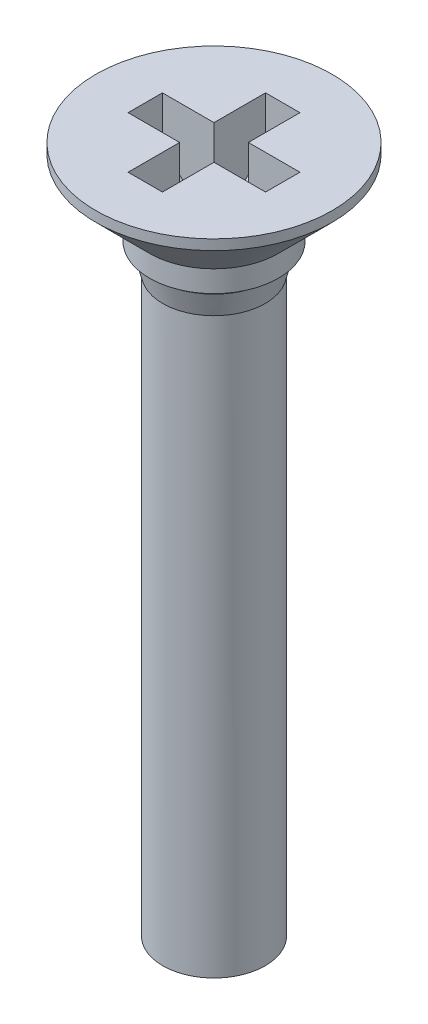
ISO-10303-21;
HEADER;
FILE_DESCRIPTION(('STEP AP214'),'2;1');
FILE_NAME('part.step','',(''),(''),'','','');
FILE_SCHEMA(('AUTOMOTIVE_DESIGN { 1 0 10303 214 1 1 1 1 }'));
ENDSEC;
DATA;
#1=APPLICATION_CONTEXT('core data for automotive mechanical design processes');
#2=APPLICATION_PROTOCOL_DEFINITION('international standard','automotive_design',2000,#1);
#3=PRODUCT_CONTEXT('',#1,'mechanical');
#4=PRODUCT('Part','Part','',(#3));
#5=PRODUCT_RELATED_PRODUCT_CATEGORY('part','',(#4));
#6=PRODUCT_DEFINITION_FORMATION('','',#4);
#7=PRODUCT_DEFINITION_CONTEXT('part definition',#1,'design');
#8=PRODUCT_DEFINITION('design','',#6,#7);
#9=PRODUCT_DEFINITION_SHAPE('','',#8);
#10=(LENGTH_UNIT() NAMED_UNIT(*) SI_UNIT(.MILLI.,.METRE.));
#11=(NAMED_UNIT(*) PLANE_ANGLE_UNIT() SI_UNIT($,.RADIAN.));
#12=(NAMED_UNIT(*) SI_UNIT($,.STERADIAN.) SOLID_ANGLE_UNIT());
#13=UNCERTAINTY_MEASURE_WITH_UNIT(LENGTH_MEASURE(1.E-05),#10,'distance_accuracy_value','');
#14=(GEOMETRIC_REPRESENTATION_CONTEXT(3) GLOBAL_UNCERTAINTY_ASSIGNED_CONTEXT((#13)) GLOBAL_UNIT_ASSIGNED_CONTEXT((#10,
#11,#12)) REPRESENTATION_CONTEXT('',''));
#15=CARTESIAN_POINT('',(0.,0.,0.));
#16=DIRECTION('',(0.,0.,1.));
#17=DIRECTION('',(1.,0.,0.));
#18=AXIS2_PLACEMENT_3D('',#15,#16,#17);
#19=CARTESIAN_POINT('',(0.,-2.65,-0.4));
#20=DIRECTION('',(0.,0.,-1.));
#21=DIRECTION('',(-1.,0.,0.));
#22=AXIS2_PLACEMENT_3D('',#19,#20,#21);
#23=PLANE('',#22);
#24=DIRECTION('',(0.,1.,0.));
#25=VECTOR('',#24,1.);
#26=CARTESIAN_POINT('',(0.4,-2.65,-0.4));
#27=LINE('',#26,#25);
#28=CARTESIAN_POINT('',(0.4,-2.1,-0.4));
#29=VERTEX_POINT('',#28);
#30=CARTESIAN_POINT('',(0.4,0.,-0.4));
#31=VERTEX_POINT('',#30);
#32=EDGE_CURVE('E202',#29,#31,#27,.T.);
#33=ORIENTED_EDGE('',*,*,#32,.F.);
#34=DIRECTION('',(1.,0.,0.));
#35=VECTOR('',#34,1.);
#36=CARTESIAN_POINT('',(-0.550000000000002,-2.1,-0.4));
#37=LINE('',#36,#35);
#38=CARTESIAN_POINT('',(0.550000000000002,-2.1,-0.4));
#39=VERTEX_POINT('',#38);
#40=EDGE_CURVE('E237',#29,#39,#37,.T.);
#41=ORIENTED_EDGE('',*,*,#40,.T.);
#42=DIRECTION('',(0.707106781186546,0.707106781186548,0.));
#43=VECTOR('',#42,1.);
#44=CARTESIAN_POINT('',(1.6,-1.05,-0.4));
#45=LINE('',#44,#43);
#46=CARTESIAN_POINT('',(1.6,-1.05,-0.4));
#47=VERTEX_POINT('',#46);
#48=EDGE_CURVE('E241',#39,#47,#45,.T.);
#49=ORIENTED_EDGE('',*,*,#48,.T.);
#50=DIRECTION('',(0.,1.,0.));
#51=VECTOR('',#50,1.);
#52=CARTESIAN_POINT('',(1.6,0.,-0.4));
#53=LINE('',#52,#51);
#54=CARTESIAN_POINT('',(1.6,0.,-0.4));
#55=VERTEX_POINT('',#54);
#56=EDGE_CURVE('E244',#47,#55,#53,.T.);
#57=ORIENTED_EDGE('',*,*,#56,.T.);
#58=DIRECTION('',(-1.,0.,0.));
#59=VECTOR('',#58,1.);
#60=CARTESIAN_POINT('',(1.6,0.,-0.4));
#61=LINE('',#60,#59);
#62=EDGE_CURVE('E248',#55,#31,#61,.T.);
#63=ORIENTED_EDGE('',*,*,#62,.T.);
#64=EDGE_LOOP('',(#33,#41,#49,#57,#63));
#65=FACE_BOUND('',#64,.T.);
#66=ADVANCED_FACE('F37',(#65),#23,.F.);
#67=CARTESIAN_POINT('',(0.,-2.65,0.4));
#68=DIRECTION('',(0.,0.,-1.));
#69=DIRECTION('',(-1.,0.,0.));
#70=AXIS2_PLACEMENT_3D('',#67,#68,#69);
#71=PLANE('',#70);
#72=DIRECTION('',(1.,0.,0.));
#73=VECTOR('',#72,1.);
#74=CARTESIAN_POINT('',(-0.550000000000002,-2.1,0.4));
#75=LINE('',#74,#73);
#76=CARTESIAN_POINT('',(0.4,-2.1,0.4));
#77=VERTEX_POINT('',#76);
#78=CARTESIAN_POINT('',(0.550000000000002,-2.1,0.4));
#79=VERTEX_POINT('',#78);
#80=EDGE_CURVE('E219',#77,#79,#75,.T.);
#81=ORIENTED_EDGE('',*,*,#80,.F.);
#82=DIRECTION('',(0.,1.,0.));
#83=VECTOR('',#82,1.);
#84=CARTESIAN_POINT('',(0.4,-2.65,0.4));
#85=LINE('',#84,#83);
#86=CARTESIAN_POINT('',(0.4,0.,0.4));
#87=VERTEX_POINT('',#86);
#88=EDGE_CURVE('E45',#77,#87,#85,.T.);
#89=ORIENTED_EDGE('',*,*,#88,.T.);
#90=DIRECTION('',(-1.,0.,0.));
#91=VECTOR('',#90,1.);
#92=CARTESIAN_POINT('',(1.6,0.,0.4));
#93=LINE('',#92,#91);
#94=CARTESIAN_POINT('',(1.6,0.,0.4));
#95=VERTEX_POINT('',#94);
#96=EDGE_CURVE('E228',#95,#87,#93,.T.);
#97=ORIENTED_EDGE('',*,*,#96,.F.);
#98=DIRECTION('',(0.,1.,0.));
#99=VECTOR('',#98,1.);
#100=CARTESIAN_POINT('',(1.6,0.,0.4));
#101=LINE('',#100,#99);
#102=CARTESIAN_POINT('',(1.6,-1.05,0.4));
#103=VERTEX_POINT('',#102);
#104=EDGE_CURVE('E225',#103,#95,#101,.T.);
#105=ORIENTED_EDGE('',*,*,#104,.F.);
#106=DIRECTION('',(0.707106781186546,0.707106781186548,0.));
#107=VECTOR('',#106,1.);
#108=CARTESIAN_POINT('',(1.6,-1.05,0.4));
#109=LINE('',#108,#107);
#110=EDGE_CURVE('E222',#79,#103,#109,.T.);
#111=ORIENTED_EDGE('',*,*,#110,.F.);
#112=EDGE_LOOP('',(#81,#89,#97,#105,#111));
#113=FACE_BOUND('',#112,.T.);
#114=ADVANCED_FACE('F291',(#113),#71,.T.);
#115=CARTESIAN_POINT('',(0.,0.,0.));
#116=DIRECTION('',(0.,-1.,0.));
#117=DIRECTION('',(1.,0.,0.));
#118=AXIS2_PLACEMENT_3D('',#115,#116,#117);
#119=PLANE('',#118);
#120=DIRECTION('',(1.,0.,0.));
#121=VECTOR('',#120,1.);
#122=CARTESIAN_POINT('',(-0.4,0.,1.6));
#123=LINE('',#122,#121);
#124=CARTESIAN_POINT('',(-0.4,0.,1.6));
#125=VERTEX_POINT('',#124);
#126=CARTESIAN_POINT('',(0.4,0.,1.6));
#127=VERTEX_POINT('',#126);
#128=EDGE_CURVE('E203',#125,#127,#123,.T.);
#129=ORIENTED_EDGE('',*,*,#128,.F.);
#130=DIRECTION('',(0.,0.,1.));
#131=VECTOR('',#130,1.);
#132=CARTESIAN_POINT('',(-0.4,0.,-1.6));
#133=LINE('',#132,#131);
#134=CARTESIAN_POINT('',(-0.4,0.,0.399999999999999));
#135=VERTEX_POINT('',#134);
#136=EDGE_CURVE('E196',#135,#125,#133,.T.);
#137=ORIENTED_EDGE('',*,*,#136,.F.);
#138=CARTESIAN_POINT('',(-1.6,0.,0.4));
#139=VERTEX_POINT('',#138);
#140=EDGE_CURVE('E227',#135,#139,#93,.T.);
#141=ORIENTED_EDGE('',*,*,#140,.T.);
#142=DIRECTION('',(0.,0.,1.));
#143=VECTOR('',#142,1.);
#144=CARTESIAN_POINT('',(-1.6,0.,-0.4));
#145=LINE('',#144,#143);
#146=CARTESIAN_POINT('',(-1.6,0.,-0.4));
#147=VERTEX_POINT('',#146);
#148=EDGE_CURVE('E258',#147,#139,#145,.T.);
#149=ORIENTED_EDGE('',*,*,#148,.F.);
#150=CARTESIAN_POINT('',(-0.4,0.,-0.4));
#151=VERTEX_POINT('',#150);
#152=EDGE_CURVE('E247',#151,#147,#61,.T.);
#153=ORIENTED_EDGE('',*,*,#152,.F.);
#154=CARTESIAN_POINT('',(-0.4,0.,-1.6));
#155=VERTEX_POINT('',#154);
#156=EDGE_CURVE('E197',#155,#151,#133,.T.);
#157=ORIENTED_EDGE('',*,*,#156,.F.);
#158=DIRECTION('',(1.,0.,0.));
#159=VECTOR('',#158,1.);
#160=CARTESIAN_POINT('',(-0.4,0.,-1.6));
#161=LINE('',#160,#159);
#162=CARTESIAN_POINT('',(0.4,0.,-1.6));
#163=VERTEX_POINT('',#162);
#164=EDGE_CURVE('E205',#155,#163,#161,.T.);
#165=ORIENTED_EDGE('',*,*,#164,.T.);
#166=DIRECTION('',(0.,0.,1.));
#167=VECTOR('',#166,1.);
#168=CARTESIAN_POINT('',(0.4,0.,-1.6));
#169=LINE('',#168,#167);
#170=EDGE_CURVE('E181',#163,#31,#169,.T.);
#171=ORIENTED_EDGE('',*,*,#170,.T.);
#172=ORIENTED_EDGE('',*,*,#62,.F.);
#173=DIRECTION('',(0.,0.,1.));
#174=VECTOR('',#173,1.);
#175=CARTESIAN_POINT('',(1.6,0.,-0.4));
#176=LINE('',#175,#174);
#177=EDGE_CURVE('E261',#55,#95,#176,.T.);
#178=ORIENTED_EDGE('',*,*,#177,.T.);
#179=ORIENTED_EDGE('',*,*,#96,.T.);
#180=EDGE_CURVE('E60',#87,#127,#169,.T.);
#181=ORIENTED_EDGE('',*,*,#180,.T.);
#182=EDGE_LOOP('',(#129,#137,#141,#149,#153,#157,#165,#171,#172,#178,#179,#181));
#183=FACE_BOUND('',#182,.T.);
#184=CARTESIAN_POINT('',(0.,0.,0.));
#185=DIRECTION('',(0.,1.,0.));
#186=DIRECTION('',(-1.,0.,0.));
#187=AXIS2_PLACEMENT_3D('',#184,#185,#186);
#188=CIRCLE('',#187,2.75);
#189=CARTESIAN_POINT('',(-2.75,0.,0.));
#190=VERTEX_POINT('',#189);
#191=EDGE_CURVE('E287',#190,#190,#188,.T.);
#192=ORIENTED_EDGE('',*,*,#191,.T.);
#193=EDGE_LOOP('',(#192));
#194=FACE_BOUND('',#193,.T.);
#195=ADVANCED_FACE('F39',(#183,#194),#119,.F.);
#196=CARTESIAN_POINT('',(0.,0.,0.));
#197=DIRECTION('',(0.,1.,0.));
#198=DIRECTION('',(-1.,0.,0.));
#199=AXIS2_PLACEMENT_3D('',#196,#197,#198);
#200=CYLINDRICAL_SURFACE('',#199,2.75);
#201=ORIENTED_EDGE('',*,*,#191,.F.);
#202=EDGE_LOOP('',(#201));
#203=FACE_BOUND('',#202,.T.);
#204=CARTESIAN_POINT('',(0.,-0.237500000000007,0.));
#205=DIRECTION('',(0.,1.,0.));
#206=DIRECTION('',(-1.,0.,0.));
#207=AXIS2_PLACEMENT_3D('',#204,#205,#206);
#208=CIRCLE('',#207,2.75);
#209=CARTESIAN_POINT('',(-2.75,-0.237500000000007,0.));
#210=VERTEX_POINT('',#209);
#211=EDGE_CURVE('E284',#210,#210,#208,.T.);
#212=ORIENTED_EDGE('',*,*,#211,.T.);
#213=EDGE_LOOP('',(#212));
#214=FACE_BOUND('',#213,.T.);
#215=ADVANCED_FACE('F396',(#203,#214),#200,.T.);
#216=CARTESIAN_POINT('',(0.,-1.4875,0.));
#217=DIRECTION('',(0.,1.,0.));
#218=DIRECTION('',(-1.,0.,0.));
#219=AXIS2_PLACEMENT_3D('',#216,#217,#218);
#220=CONICAL_SURFACE('',#219,1.5,0.78539816339745);
#221=ORIENTED_EDGE('',*,*,#211,.F.);
#222=EDGE_LOOP('',(#221));
#223=FACE_BOUND('',#222,.T.);
#224=CARTESIAN_POINT('',(0.,-1.4875,0.));
#225=DIRECTION('',(0.,1.,0.));
#226=DIRECTION('',(-1.,0.,0.));
#227=AXIS2_PLACEMENT_3D('',#224,#225,#226);
#228=CIRCLE('',#227,1.5);
#229=CARTESIAN_POINT('',(-1.5,-1.4875,0.));
#230=VERTEX_POINT('',#229);
#231=EDGE_CURVE('E281',#230,#230,#228,.T.);
#232=ORIENTED_EDGE('',*,*,#231,.T.);
#233=EDGE_LOOP('',(#232));
#234=FACE_BOUND('',#233,.T.);
#235=ADVANCED_FACE('F393',(#223,#234),#220,.T.);
#236=CARTESIAN_POINT('',(0.,0.,0.));
#237=DIRECTION('',(0.,1.,0.));
#238=DIRECTION('',(-1.,0.,0.));
#239=AXIS2_PLACEMENT_3D('',#236,#237,#238);
#240=CYLINDRICAL_SURFACE('',#239,1.5);
#241=ORIENTED_EDGE('',*,*,#231,.F.);
#242=EDGE_LOOP('',(#241));
#243=FACE_BOUND('',#242,.T.);
#244=CARTESIAN_POINT('',(0.,-1.9875,0.));
#245=DIRECTION('',(0.,1.,0.));
#246=DIRECTION('',(-1.,0.,0.));
#247=AXIS2_PLACEMENT_3D('',#244,#245,#246);
#248=CIRCLE('',#247,1.5);
#249=CARTESIAN_POINT('',(-1.5,-1.9875,0.));
#250=VERTEX_POINT('',#249);
#251=EDGE_CURVE('E278',#250,#250,#248,.T.);
#252=ORIENTED_EDGE('',*,*,#251,.T.);
#253=EDGE_LOOP('',(#252));
#254=FACE_BOUND('',#253,.T.);
#255=ADVANCED_FACE('F389',(#243,#254),#240,.T.);
#256=CARTESIAN_POINT('',(1.5,-1.9875,0.));
#257=DIRECTION('',(0.,1.,0.));
#258=DIRECTION('',(-1.,0.,0.));
#259=AXIS2_PLACEMENT_3D('',#256,#257,#258);
#260=PLANE('',#259);
#261=ORIENTED_EDGE('',*,*,#251,.F.);
#262=EDGE_LOOP('',(#261));
#263=FACE_BOUND('',#262,.T.);
#264=CARTESIAN_POINT('',(0.,-1.9875,0.));
#265=DIRECTION('',(0.,1.,0.));
#266=DIRECTION('',(-1.,0.,0.));
#267=AXIS2_PLACEMENT_3D('',#264,#265,#266);
#268=CIRCLE('',#267,1.3375);
#269=CARTESIAN_POINT('',(-1.3375,-1.9875,0.));
#270=VERTEX_POINT('',#269);
#271=EDGE_CURVE('E275',#270,#270,#268,.T.);
#272=ORIENTED_EDGE('',*,*,#271,.T.);
#273=EDGE_LOOP('',(#272));
#274=FACE_BOUND('',#273,.T.);
#275=ADVANCED_FACE('F385',(#263,#274),#260,.F.);
#276=CARTESIAN_POINT('',(0.,0.,0.));
#277=DIRECTION('',(0.,1.,0.));
#278=DIRECTION('',(-1.,0.,0.));
#279=AXIS2_PLACEMENT_3D('',#276,#277,#278);
#280=CYLINDRICAL_SURFACE('',#279,1.3375);
#281=ORIENTED_EDGE('',*,*,#271,.F.);
#282=EDGE_LOOP('',(#281));
#283=FACE_BOUND('',#282,.T.);
#284=CARTESIAN_POINT('',(0.,-2.11258468371008,0.));
#285=DIRECTION('',(0.,1.,0.));
#286=DIRECTION('',(-1.,0.,0.));
#287=AXIS2_PLACEMENT_3D('',#284,#285,#286);
#288=CIRCLE('',#287,1.3375);
#289=CARTESIAN_POINT('',(-1.3375,-2.11258468371008,0.));
#290=VERTEX_POINT('',#289);
#291=EDGE_CURVE('E272',#290,#290,#288,.T.);
#292=ORIENTED_EDGE('',*,*,#291,.T.);
#293=EDGE_LOOP('',(#292));
#294=FACE_BOUND('',#293,.T.);
#295=ADVANCED_FACE('F381',(#283,#294),#280,.T.);
#296=CARTESIAN_POINT('',(0.,-2.65,0.));
#297=DIRECTION('',(0.,1.,0.));
#298=DIRECTION('',(-1.,0.,0.));
#299=AXIS2_PLACEMENT_3D('',#296,#297,#298);
#300=CONICAL_SURFACE('',#299,1.1935,0.26179938779915);
#301=ORIENTED_EDGE('',*,*,#291,.F.);
#302=EDGE_LOOP('',(#301));
#303=FACE_BOUND('',#302,.T.);
#304=CARTESIAN_POINT('',(0.,-2.65,0.));
#305=DIRECTION('',(0.,1.,0.));
#306=DIRECTION('',(-1.,0.,0.));
#307=AXIS2_PLACEMENT_3D('',#304,#305,#306);
#308=CIRCLE('',#307,1.1935);
#309=CARTESIAN_POINT('',(-1.1935,-2.65,0.));
#310=VERTEX_POINT('',#309);
#311=EDGE_CURVE('E257',#310,#310,#308,.T.);
#312=ORIENTED_EDGE('',*,*,#311,.T.);
#313=EDGE_LOOP('',(#312));
#314=FACE_BOUND('',#313,.T.);
#315=ADVANCED_FACE('F377',(#303,#314),#300,.T.);
#316=CARTESIAN_POINT('',(0.,0.,0.));
#317=DIRECTION('',(0.,1.,0.));
#318=DIRECTION('',(-1.,0.,0.));
#319=AXIS2_PLACEMENT_3D('',#316,#317,#318);
#320=CYLINDRICAL_SURFACE('',#319,1.1935);
#321=ORIENTED_EDGE('',*,*,#311,.F.);
#322=EDGE_LOOP('',(#321));
#323=FACE_BOUND('',#322,.T.);
#324=CARTESIAN_POINT('',(0.,-16.,0.));
#325=DIRECTION('',(0.,-1.,0.));
#326=DIRECTION('',(1.,0.,0.));
#327=AXIS2_PLACEMENT_3D('',#324,#325,#326);
#328=CIRCLE('',#327,1.1935);
#329=CARTESIAN_POINT('',(1.1935,-16.,0.));
#330=VERTEX_POINT('',#329);
#331=EDGE_CURVE('E172',#330,#330,#328,.T.);
#332=ORIENTED_EDGE('',*,*,#331,.F.);
#333=EDGE_LOOP('',(#332));
#334=FACE_BOUND('',#333,.T.);
#335=ADVANCED_FACE('F374',(#323,#334),#320,.T.);
#336=CARTESIAN_POINT('',(-1.6,-1.05,-0.4));
#337=DIRECTION('',(-0.707106781186548,-0.707106781186546,0.));
#338=DIRECTION('',(0.707106781186547,-0.707106781186548,0.));
#339=AXIS2_PLACEMENT_3D('',#336,#337,#338);
#340=PLANE('',#339);
#341=DIRECTION('',(0.,0.,1.));
#342=VECTOR('',#341,1.);
#343=CARTESIAN_POINT('',(-0.550000000000002,-2.1,-0.4));
#344=LINE('',#343,#342);
#345=CARTESIAN_POINT('',(-0.550000000000002,-2.1,-0.4));
#346=VERTEX_POINT('',#345);
#347=CARTESIAN_POINT('',(-0.550000000000002,-2.1,0.4));
#348=VERTEX_POINT('',#347);
#349=EDGE_CURVE('E254',#346,#348,#344,.T.);
#350=ORIENTED_EDGE('',*,*,#349,.F.);
#351=DIRECTION('',(0.707106781186546,-0.707106781186548,0.));
#352=VECTOR('',#351,1.);
#353=CARTESIAN_POINT('',(-1.6,-1.05,-0.4));
#354=LINE('',#353,#352);
#355=CARTESIAN_POINT('',(-1.6,-1.05,-0.4));
#356=VERTEX_POINT('',#355);
#357=EDGE_CURVE('E234',#356,#346,#354,.T.);
#358=ORIENTED_EDGE('',*,*,#357,.F.);
#359=DIRECTION('',(0.,0.,1.));
#360=VECTOR('',#359,1.);
#361=CARTESIAN_POINT('',(-1.6,-1.05,-0.4));
#362=LINE('',#361,#360);
#363=CARTESIAN_POINT('',(-1.6,-1.05,0.4));
#364=VERTEX_POINT('',#363);
#365=EDGE_CURVE('E255',#356,#364,#362,.T.);
#366=ORIENTED_EDGE('',*,*,#365,.T.);
#367=DIRECTION('',(0.707106781186546,-0.707106781186548,0.));
#368=VECTOR('',#367,1.);
#369=CARTESIAN_POINT('',(-1.6,-1.05,0.4));
#370=LINE('',#369,#368);
#371=EDGE_CURVE('E216',#364,#348,#370,.T.);
#372=ORIENTED_EDGE('',*,*,#371,.T.);
#373=EDGE_LOOP('',(#350,#358,#366,#372));
#374=FACE_BOUND('',#373,.T.);
#375=ADVANCED_FACE('F328',(#374),#340,.F.);
#376=CARTESIAN_POINT('',(-1.6,0.,-0.4));
#377=DIRECTION('',(-1.,0.,0.));
#378=DIRECTION('',(0.,0.,1.));
#379=AXIS2_PLACEMENT_3D('',#376,#377,#378);
#380=PLANE('',#379);
#381=ORIENTED_EDGE('',*,*,#365,.F.);
#382=DIRECTION('',(0.,-1.,0.));
#383=VECTOR('',#382,1.);
#384=CARTESIAN_POINT('',(-1.6,0.,-0.4));
#385=LINE('',#384,#383);
#386=EDGE_CURVE('E251',#147,#356,#385,.T.);
#387=ORIENTED_EDGE('',*,*,#386,.F.);
#388=ORIENTED_EDGE('',*,*,#148,.T.);
#389=DIRECTION('',(0.,-1.,0.));
#390=VECTOR('',#389,1.);
#391=CARTESIAN_POINT('',(-1.6,0.,0.4));
#392=LINE('',#391,#390);
#393=EDGE_CURVE('E231',#139,#364,#392,.T.);
#394=ORIENTED_EDGE('',*,*,#393,.T.);
#395=EDGE_LOOP('',(#381,#387,#388,#394));
#396=FACE_BOUND('',#395,.T.);
#397=ADVANCED_FACE('F373',(#396),#380,.F.);
#398=CARTESIAN_POINT('',(1.6,0.,-0.4));
#399=DIRECTION('',(1.,0.,0.));
#400=DIRECTION('',(0.,0.,-1.));
#401=AXIS2_PLACEMENT_3D('',#398,#399,#400);
#402=PLANE('',#401);
#403=ORIENTED_EDGE('',*,*,#177,.F.);
#404=ORIENTED_EDGE('',*,*,#56,.F.);
#405=DIRECTION('',(0.,0.,1.));
#406=VECTOR('',#405,1.);
#407=CARTESIAN_POINT('',(1.6,-1.05,-0.4));
#408=LINE('',#407,#406);
#409=EDGE_CURVE('E264',#47,#103,#408,.T.);
#410=ORIENTED_EDGE('',*,*,#409,.T.);
#411=ORIENTED_EDGE('',*,*,#104,.T.);
#412=EDGE_LOOP('',(#403,#404,#410,#411));
#413=FACE_BOUND('',#412,.T.);
#414=ADVANCED_FACE('F300',(#413),#402,.F.);
#415=CARTESIAN_POINT('',(1.6,-1.05,-0.4));
#416=DIRECTION('',(0.707106781186548,-0.707106781186546,0.));
#417=DIRECTION('',(0.707106781186547,0.707106781186548,0.));
#418=AXIS2_PLACEMENT_3D('',#415,#416,#417);
#419=PLANE('',#418);
#420=ORIENTED_EDGE('',*,*,#409,.F.);
#421=ORIENTED_EDGE('',*,*,#48,.F.);
#422=DIRECTION('',(0.,0.,1.));
#423=VECTOR('',#422,1.);
#424=CARTESIAN_POINT('',(0.550000000000002,-2.1,-0.4));
#425=LINE('',#424,#423);
#426=EDGE_CURVE('E266',#39,#79,#425,.T.);
#427=ORIENTED_EDGE('',*,*,#426,.T.);
#428=ORIENTED_EDGE('',*,*,#110,.T.);
#429=EDGE_LOOP('',(#420,#421,#427,#428));
#430=FACE_BOUND('',#429,.T.);
#431=ADVANCED_FACE('F306',(#430),#419,.F.);
#432=CARTESIAN_POINT('',(-0.550000000000002,-2.1,-0.4));
#433=DIRECTION('',(0.,-1.,0.));
#434=DIRECTION('',(0.,0.,-1.));
#435=AXIS2_PLACEMENT_3D('',#432,#433,#434);
#436=PLANE('',#435);
#437=CARTESIAN_POINT('',(-0.4,-2.1,0.4));
#438=VERTEX_POINT('',#437);
#439=EDGE_CURVE('E220',#348,#438,#75,.T.);
#440=ORIENTED_EDGE('',*,*,#439,.T.);
#441=DIRECTION('',(0.,0.,-1.));
#442=VECTOR('',#441,1.);
#443=CARTESIAN_POINT('',(-0.4,-2.1,0.550000000000002));
#444=LINE('',#443,#442);
#445=CARTESIAN_POINT('',(-0.4,-2.1,0.550000000000002));
#446=VERTEX_POINT('',#445);
#447=EDGE_CURVE('E156',#446,#438,#444,.T.);
#448=ORIENTED_EDGE('',*,*,#447,.F.);
#449=DIRECTION('',(1.,0.,0.));
#450=VECTOR('',#449,1.);
#451=CARTESIAN_POINT('',(-0.4,-2.1,0.550000000000002));
#452=LINE('',#451,#450);
#453=CARTESIAN_POINT('',(0.4,-2.1,0.550000000000002));
#454=VERTEX_POINT('',#453);
#455=EDGE_CURVE('E150',#446,#454,#452,.T.);
#456=ORIENTED_EDGE('',*,*,#455,.T.);
#457=DIRECTION('',(0.,0.,-1.));
#458=VECTOR('',#457,1.);
#459=CARTESIAN_POINT('',(0.4,-2.1,0.550000000000002));
#460=LINE('',#459,#458);
#461=EDGE_CURVE('E154',#454,#77,#460,.T.);
#462=ORIENTED_EDGE('',*,*,#461,.T.);
#463=ORIENTED_EDGE('',*,*,#80,.T.);
#464=ORIENTED_EDGE('',*,*,#426,.F.);
#465=ORIENTED_EDGE('',*,*,#40,.F.);
#466=CARTESIAN_POINT('',(0.4,-2.1,-0.550000000000002));
#467=VERTEX_POINT('',#466);
#468=EDGE_CURVE('E52',#29,#467,#460,.T.);
#469=ORIENTED_EDGE('',*,*,#468,.T.);
#470=DIRECTION('',(1.,0.,0.));
#471=VECTOR('',#470,1.);
#472=CARTESIAN_POINT('',(-0.4,-2.1,-0.550000000000002));
#473=LINE('',#472,#471);
#474=CARTESIAN_POINT('',(-0.4,-2.1,-0.550000000000002));
#475=VERTEX_POINT('',#474);
#476=EDGE_CURVE('E161',#475,#467,#473,.T.);
#477=ORIENTED_EDGE('',*,*,#476,.F.);
#478=CARTESIAN_POINT('',(-0.4,-2.1,-0.4));
#479=VERTEX_POINT('',#478);
#480=EDGE_CURVE('E188',#479,#475,#444,.T.);
#481=ORIENTED_EDGE('',*,*,#480,.F.);
#482=EDGE_CURVE('E238',#346,#479,#37,.T.);
#483=ORIENTED_EDGE('',*,*,#482,.F.);
#484=ORIENTED_EDGE('',*,*,#349,.T.);
#485=EDGE_LOOP('',(#440,#448,#456,#462,#463,#464,#465,#469,#477,#481,#483,#484));
#486=FACE_BOUND('',#485,.T.);
#487=ADVANCED_FACE('F153',(#486),#436,.F.);
#488=ORIENTED_EDGE('',*,*,#482,.T.);
#489=DIRECTION('',(0.,1.,0.));
#490=VECTOR('',#489,1.);
#491=CARTESIAN_POINT('',(-0.4,-2.65,-0.4));
#492=LINE('',#491,#490);
#493=EDGE_CURVE('E213',#479,#151,#492,.T.);
#494=ORIENTED_EDGE('',*,*,#493,.T.);
#495=ORIENTED_EDGE('',*,*,#152,.T.);
#496=ORIENTED_EDGE('',*,*,#386,.T.);
#497=ORIENTED_EDGE('',*,*,#357,.T.);
#498=EDGE_LOOP('',(#488,#494,#495,#496,#497));
#499=FACE_BOUND('',#498,.T.);
#500=ADVANCED_FACE('F323',(#499),#23,.F.);
#501=DIRECTION('',(0.,1.,0.));
#502=VECTOR('',#501,1.);
#503=CARTESIAN_POINT('',(-0.4,-2.65,0.4));
#504=LINE('',#503,#502);
#505=EDGE_CURVE('E11',#438,#135,#504,.T.);
#506=ORIENTED_EDGE('',*,*,#505,.F.);
#507=ORIENTED_EDGE('',*,*,#439,.F.);
#508=ORIENTED_EDGE('',*,*,#371,.F.);
#509=ORIENTED_EDGE('',*,*,#393,.F.);
#510=ORIENTED_EDGE('',*,*,#140,.F.);
#511=EDGE_LOOP('',(#506,#507,#508,#509,#510));
#512=FACE_BOUND('',#511,.T.);
#513=ADVANCED_FACE('F333',(#512),#71,.T.);
#514=CARTESIAN_POINT('',(-0.4,-1.05,1.6));
#515=DIRECTION('',(0.,-0.707106781186546,0.707106781186548));
#516=DIRECTION('',(0.,-0.707106781186548,-0.707106781186547));
#517=AXIS2_PLACEMENT_3D('',#514,#515,#516);
#518=PLANE('',#517);
#519=ORIENTED_EDGE('',*,*,#455,.F.);
#520=DIRECTION('',(0.,-0.707106781186548,-0.707106781186546));
#521=VECTOR('',#520,1.);
#522=CARTESIAN_POINT('',(-0.4,-1.05,1.6));
#523=LINE('',#522,#521);
#524=CARTESIAN_POINT('',(-0.4,-1.05,1.6));
#525=VERTEX_POINT('',#524);
#526=EDGE_CURVE('E186',#525,#446,#523,.T.);
#527=ORIENTED_EDGE('',*,*,#526,.F.);
#528=DIRECTION('',(1.,0.,0.));
#529=VECTOR('',#528,1.);
#530=CARTESIAN_POINT('',(-0.4,-1.05,1.6));
#531=LINE('',#530,#529);
#532=CARTESIAN_POINT('',(0.4,-1.05,1.6));
#533=VERTEX_POINT('',#532);
#534=EDGE_CURVE('E170',#525,#533,#531,.T.);
#535=ORIENTED_EDGE('',*,*,#534,.T.);
#536=DIRECTION('',(0.,-0.707106781186548,-0.707106781186546));
#537=VECTOR('',#536,1.);
#538=CARTESIAN_POINT('',(0.4,-1.05,1.6));
#539=LINE('',#538,#537);
#540=EDGE_CURVE('E166',#533,#454,#539,.T.);
#541=ORIENTED_EDGE('',*,*,#540,.T.);
#542=EDGE_LOOP('',(#519,#527,#535,#541));
#543=FACE_BOUND('',#542,.T.);
#544=ADVANCED_FACE('F169',(#543),#518,.F.);
#545=CARTESIAN_POINT('',(-0.4,-2.65,0.));
#546=DIRECTION('',(-1.,0.,0.));
#547=DIRECTION('',(0.,0.,1.));
#548=AXIS2_PLACEMENT_3D('',#545,#546,#547);
#549=PLANE('',#548);
#550=ORIENTED_EDGE('',*,*,#505,.T.);
#551=ORIENTED_EDGE('',*,*,#136,.T.);
#552=DIRECTION('',(0.,-1.,0.));
#553=VECTOR('',#552,1.);
#554=CARTESIAN_POINT('',(-0.4,0.,1.6));
#555=LINE('',#554,#553);
#556=EDGE_CURVE('E162',#125,#525,#555,.T.);
#557=ORIENTED_EDGE('',*,*,#556,.T.);
#558=ORIENTED_EDGE('',*,*,#526,.T.);
#559=ORIENTED_EDGE('',*,*,#447,.T.);
#560=EDGE_LOOP('',(#550,#551,#557,#558,#559));
#561=FACE_BOUND('',#560,.T.);
#562=ADVANCED_FACE('F338',(#561),#549,.F.);
#563=CARTESIAN_POINT('',(0.4,-2.65,0.));
#564=DIRECTION('',(-1.,0.,0.));
#565=DIRECTION('',(0.,0.,1.));
#566=AXIS2_PLACEMENT_3D('',#563,#564,#565);
#567=PLANE('',#566);
#568=ORIENTED_EDGE('',*,*,#461,.F.);
#569=ORIENTED_EDGE('',*,*,#540,.F.);
#570=DIRECTION('',(0.,-1.,0.));
#571=VECTOR('',#570,1.);
#572=CARTESIAN_POINT('',(0.4,0.,1.6));
#573=LINE('',#572,#571);
#574=EDGE_CURVE('E184',#127,#533,#573,.T.);
#575=ORIENTED_EDGE('',*,*,#574,.F.);
#576=ORIENTED_EDGE('',*,*,#180,.F.);
#577=ORIENTED_EDGE('',*,*,#88,.F.);
#578=EDGE_LOOP('',(#568,#569,#575,#576,#577));
#579=FACE_BOUND('',#578,.T.);
#580=ADVANCED_FACE('F165',(#579),#567,.T.);
#581=CARTESIAN_POINT('',(-0.4,0.,1.6));
#582=DIRECTION('',(0.,0.,1.));
#583=DIRECTION('',(1.,0.,0.));
#584=AXIS2_PLACEMENT_3D('',#581,#582,#583);
#585=PLANE('',#584);
#586=ORIENTED_EDGE('',*,*,#534,.F.);
#587=ORIENTED_EDGE('',*,*,#556,.F.);
#588=ORIENTED_EDGE('',*,*,#128,.T.);
#589=ORIENTED_EDGE('',*,*,#574,.T.);
#590=EDGE_LOOP('',(#586,#587,#588,#589));
#591=FACE_BOUND('',#590,.T.);
#592=ADVANCED_FACE('F342',(#591),#585,.F.);
#593=ORIENTED_EDGE('',*,*,#480,.T.);
#594=DIRECTION('',(0.,0.707106781186548,-0.707106781186546));
#595=VECTOR('',#594,1.);
#596=CARTESIAN_POINT('',(-0.4,-1.05,-1.6));
#597=LINE('',#596,#595);
#598=CARTESIAN_POINT('',(-0.4,-1.05,-1.6));
#599=VERTEX_POINT('',#598);
#600=EDGE_CURVE('E190',#475,#599,#597,.T.);
#601=ORIENTED_EDGE('',*,*,#600,.T.);
#602=DIRECTION('',(0.,1.,0.));
#603=VECTOR('',#602,1.);
#604=CARTESIAN_POINT('',(-0.4,0.,-1.6));
#605=LINE('',#604,#603);
#606=EDGE_CURVE('E193',#599,#155,#605,.T.);
#607=ORIENTED_EDGE('',*,*,#606,.T.);
#608=ORIENTED_EDGE('',*,*,#156,.T.);
#609=ORIENTED_EDGE('',*,*,#493,.F.);
#610=EDGE_LOOP('',(#593,#601,#607,#608,#609));
#611=FACE_BOUND('',#610,.T.);
#612=ADVANCED_FACE('F320',(#611),#549,.F.);
#613=ORIENTED_EDGE('',*,*,#32,.T.);
#614=ORIENTED_EDGE('',*,*,#170,.F.);
#615=DIRECTION('',(0.,1.,0.));
#616=VECTOR('',#615,1.);
#617=CARTESIAN_POINT('',(0.4,0.,-1.6));
#618=LINE('',#617,#616);
#619=CARTESIAN_POINT('',(0.4,-1.05,-1.6));
#620=VERTEX_POINT('',#619);
#621=EDGE_CURVE('E179',#620,#163,#618,.T.);
#622=ORIENTED_EDGE('',*,*,#621,.F.);
#623=DIRECTION('',(0.,0.707106781186548,-0.707106781186546));
#624=VECTOR('',#623,1.);
#625=CARTESIAN_POINT('',(0.4,-1.05,-1.6));
#626=LINE('',#625,#624);
#627=EDGE_CURVE('E167',#467,#620,#626,.T.);
#628=ORIENTED_EDGE('',*,*,#627,.F.);
#629=ORIENTED_EDGE('',*,*,#468,.F.);
#630=EDGE_LOOP('',(#613,#614,#622,#628,#629));
#631=FACE_BOUND('',#630,.T.);
#632=ADVANCED_FACE('F313',(#631),#567,.T.);
#633=CARTESIAN_POINT('',(-0.4,0.,-1.6));
#634=DIRECTION('',(0.,0.,-1.));
#635=DIRECTION('',(-1.,0.,0.));
#636=AXIS2_PLACEMENT_3D('',#633,#634,#635);
#637=PLANE('',#636);
#638=ORIENTED_EDGE('',*,*,#164,.F.);
#639=ORIENTED_EDGE('',*,*,#606,.F.);
#640=DIRECTION('',(1.,0.,0.));
#641=VECTOR('',#640,1.);
#642=CARTESIAN_POINT('',(-0.4,-1.05,-1.6));
#643=LINE('',#642,#641);
#644=EDGE_CURVE('E208',#599,#620,#643,.T.);
#645=ORIENTED_EDGE('',*,*,#644,.T.);
#646=ORIENTED_EDGE('',*,*,#621,.T.);
#647=EDGE_LOOP('',(#638,#639,#645,#646));
#648=FACE_BOUND('',#647,.T.);
#649=ADVANCED_FACE('F316',(#648),#637,.F.);
#650=CARTESIAN_POINT('',(-0.4,-1.05,-1.6));
#651=DIRECTION('',(0.,-0.707106781186546,-0.707106781186548));
#652=DIRECTION('',(0.,0.707106781186548,-0.707106781186547));
#653=AXIS2_PLACEMENT_3D('',#650,#651,#652);
#654=PLANE('',#653);
#655=ORIENTED_EDGE('',*,*,#644,.F.);
#656=ORIENTED_EDGE('',*,*,#600,.F.);
#657=ORIENTED_EDGE('',*,*,#476,.T.);
#658=ORIENTED_EDGE('',*,*,#627,.T.);
#659=EDGE_LOOP('',(#655,#656,#657,#658));
#660=FACE_BOUND('',#659,.T.);
#661=ADVANCED_FACE('F311',(#660),#654,.F.);
#662=CARTESIAN_POINT('',(0.,-16.,0.));
#663=DIRECTION('',(0.,-1.,0.));
#664=DIRECTION('',(1.,0.,0.));
#665=AXIS2_PLACEMENT_3D('',#662,#663,#664);
#666=PLANE('',#665);
#667=ORIENTED_EDGE('',*,*,#331,.T.);
#668=EDGE_LOOP('',(#667));
#669=FACE_BOUND('',#668,.T.);
#670=ADVANCED_FACE('F419',(#669),#666,.T.);
#671=CLOSED_SHELL('',(#66,#114,#195,#215,#235,#255,#275,#295,#315,#335,#375,#397,#414,#431,#487,
#500,#513,#544,#562,#580,#592,#612,#632,#649,#661,#670));
#672=MANIFOLD_SOLID_BREP('B2',#671);
#673=ADVANCED_BREP_SHAPE_REPRESENTATION('',(#18,#672),#14);
#674=SHAPE_DEFINITION_REPRESENTATION(#9,#673);
ENDSEC;
END-ISO-10303-21;
